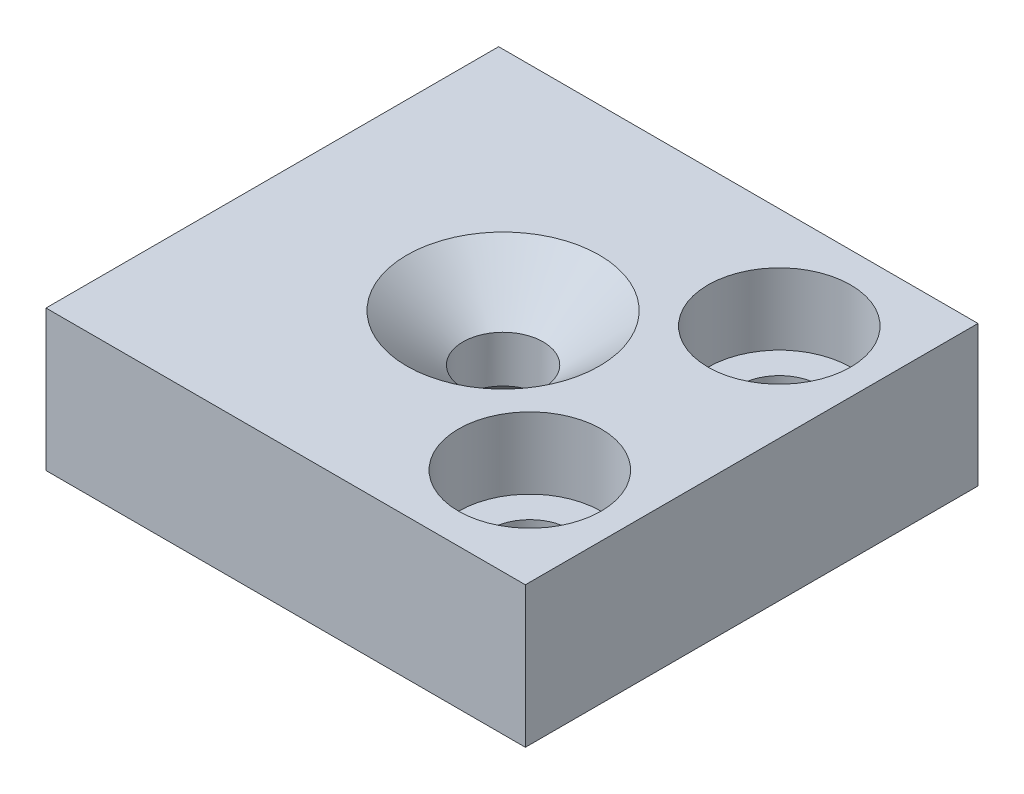
ISO-10303-21;
HEADER;
FILE_DESCRIPTION(('STEP AP214'),'2;1');
FILE_NAME('part.step','',(''),(''),'','','');
FILE_SCHEMA(('AUTOMOTIVE_DESIGN { 1 0 10303 214 1 1 1 1 }'));
ENDSEC;
DATA;
#1=APPLICATION_CONTEXT('core data for automotive mechanical design processes');
#2=APPLICATION_PROTOCOL_DEFINITION('international standard','automotive_design',2000,#1);
#3=PRODUCT_CONTEXT('',#1,'mechanical');
#4=PRODUCT('Part','Part','',(#3));
#5=PRODUCT_RELATED_PRODUCT_CATEGORY('part','',(#4));
#6=PRODUCT_DEFINITION_FORMATION('','',#4);
#7=PRODUCT_DEFINITION_CONTEXT('part definition',#1,'design');
#8=PRODUCT_DEFINITION('design','',#6,#7);
#9=PRODUCT_DEFINITION_SHAPE('','',#8);
#10=(LENGTH_UNIT() NAMED_UNIT(*) SI_UNIT(.MILLI.,.METRE.));
#11=(NAMED_UNIT(*) PLANE_ANGLE_UNIT() SI_UNIT($,.RADIAN.));
#12=(NAMED_UNIT(*) SI_UNIT($,.STERADIAN.) SOLID_ANGLE_UNIT());
#13=UNCERTAINTY_MEASURE_WITH_UNIT(LENGTH_MEASURE(1.E-05),#10,'distance_accuracy_value','');
#14=(GEOMETRIC_REPRESENTATION_CONTEXT(3) GLOBAL_UNCERTAINTY_ASSIGNED_CONTEXT((#13)) GLOBAL_UNIT_ASSIGNED_CONTEXT((#10,
#11,#12)) REPRESENTATION_CONTEXT('',''));
#15=CARTESIAN_POINT('',(0.,0.,0.));
#16=DIRECTION('',(0.,0.,1.));
#17=DIRECTION('',(1.,0.,0.));
#18=AXIS2_PLACEMENT_3D('',#15,#16,#17);
#19=CARTESIAN_POINT('',(9.50000000017326,3.95,-19.7));
#20=DIRECTION('',(-1.,0.,0.));
#21=DIRECTION('',(0.,0.,1.));
#22=AXIS2_PLACEMENT_3D('',#19,#20,#21);
#23=CONICAL_SURFACE('',#22,1.64999999975608,1.02974425845289);
#24=CARTESIAN_POINT('',(10.4914200215944,3.95,-19.7000000001137));
#25=VERTEX_POINT('',#24);
#26=VERTEX_LOOP('',#25);
#27=FACE_BOUND('',#26,.T.);
#28=CARTESIAN_POINT('',(9.5,3.95,-19.7));
#29=DIRECTION('',(-1.,0.,0.));
#30=DIRECTION('',(0.,0.,1.));
#31=AXIS2_PLACEMENT_3D('',#28,#29,#30);
#32=CIRCLE('',#31,1.65);
#33=CARTESIAN_POINT('',(9.5,3.95,-18.05));
#34=VERTEX_POINT('',#33);
#35=EDGE_CURVE('E67',#34,#34,#32,.T.);
#36=ORIENTED_EDGE('',*,*,#35,.T.);
#37=EDGE_LOOP('',(#36));
#38=FACE_BOUND('',#37,.T.);
#39=ADVANCED_FACE('F17',(#27,#38),#23,.F.);
#40=CARTESIAN_POINT('',(9.50000000000273,3.95,-5.7));
#41=DIRECTION('',(-1.,0.,0.));
#42=DIRECTION('',(0.,0.,1.));
#43=AXIS2_PLACEMENT_3D('',#40,#41,#42);
#44=CONICAL_SURFACE('',#43,1.64999999987976,1.02974425849377);
#45=CARTESIAN_POINT('',(10.4914200215092,3.95,-5.70000000005684));
#46=VERTEX_POINT('',#45);
#47=VERTEX_LOOP('',#46);
#48=FACE_BOUND('',#47,.T.);
#49=CARTESIAN_POINT('',(9.5,3.95,-5.7));
#50=DIRECTION('',(-1.,0.,0.));
#51=DIRECTION('',(0.,0.,1.));
#52=AXIS2_PLACEMENT_3D('',#49,#50,#51);
#53=CIRCLE('',#52,1.65);
#54=CARTESIAN_POINT('',(9.5,3.95,-4.05));
#55=VERTEX_POINT('',#54);
#56=EDGE_CURVE('E69',#55,#55,#53,.T.);
#57=ORIENTED_EDGE('',*,*,#56,.T.);
#58=EDGE_LOOP('',(#57));
#59=FACE_BOUND('',#58,.T.);
#60=ADVANCED_FACE('F64',(#48,#59),#44,.F.);
#61=CARTESIAN_POINT('',(21.45,7.9,-5.7));
#62=DIRECTION('',(0.,1.,0.));
#63=DIRECTION('',(0.,0.,1.));
#64=AXIS2_PLACEMENT_3D('',#61,#62,#63);
#65=CYLINDRICAL_SURFACE('',#64,4.);
#66=CARTESIAN_POINT('',(21.45,3.9,-5.7));
#67=DIRECTION('',(0.,1.,0.));
#68=DIRECTION('',(0.,0.,1.));
#69=AXIS2_PLACEMENT_3D('',#66,#67,#68);
#70=CIRCLE('',#69,4.);
#71=CARTESIAN_POINT('',(21.45,3.9,-1.7));
#72=VERTEX_POINT('',#71);
#73=EDGE_CURVE('E20',#72,#72,#70,.F.);
#74=ORIENTED_EDGE('',*,*,#73,.T.);
#75=EDGE_LOOP('',(#74));
#76=FACE_BOUND('',#75,.T.);
#77=CARTESIAN_POINT('',(21.45,7.9,-5.7));
#78=DIRECTION('',(0.,1.,0.));
#79=DIRECTION('',(0.,0.,1.));
#80=AXIS2_PLACEMENT_3D('',#77,#78,#79);
#81=CIRCLE('',#80,4.);
#82=CARTESIAN_POINT('',(21.45,7.9,-1.7));
#83=VERTEX_POINT('',#82);
#84=EDGE_CURVE('E73',#83,#83,#81,.T.);
#85=ORIENTED_EDGE('',*,*,#84,.T.);
#86=EDGE_LOOP('',(#85));
#87=FACE_BOUND('',#86,.T.);
#88=ADVANCED_FACE('F117',(#76,#87),#65,.F.);
#89=CARTESIAN_POINT('',(21.45,7.9,-19.7));
#90=DIRECTION('',(0.,1.,0.));
#91=DIRECTION('',(0.,0.,1.));
#92=AXIS2_PLACEMENT_3D('',#89,#90,#91);
#93=CYLINDRICAL_SURFACE('',#92,4.);
#94=CARTESIAN_POINT('',(21.45,3.9,-19.7));
#95=DIRECTION('',(0.,1.,0.));
#96=DIRECTION('',(0.,0.,1.));
#97=AXIS2_PLACEMENT_3D('',#94,#95,#96);
#98=CIRCLE('',#97,4.);
#99=CARTESIAN_POINT('',(21.45,3.9,-15.7));
#100=VERTEX_POINT('',#99);
#101=EDGE_CURVE('E76',#100,#100,#98,.F.);
#102=ORIENTED_EDGE('',*,*,#101,.T.);
#103=EDGE_LOOP('',(#102));
#104=FACE_BOUND('',#103,.T.);
#105=CARTESIAN_POINT('',(21.45,7.9,-19.7));
#106=DIRECTION('',(0.,1.,0.));
#107=DIRECTION('',(0.,0.,1.));
#108=AXIS2_PLACEMENT_3D('',#105,#106,#107);
#109=CIRCLE('',#108,4.);
#110=CARTESIAN_POINT('',(21.45,7.9,-15.7));
#111=VERTEX_POINT('',#110);
#112=EDGE_CURVE('E107',#111,#111,#109,.T.);
#113=ORIENTED_EDGE('',*,*,#112,.T.);
#114=EDGE_LOOP('',(#113));
#115=FACE_BOUND('',#114,.T.);
#116=ADVANCED_FACE('F198',(#104,#115),#93,.F.);
#117=CARTESIAN_POINT('',(12.95,7.90000000000646,-12.7));
#118=DIRECTION('',(0.,1.,0.));
#119=DIRECTION('',(0.,0.,1.));
#120=AXIS2_PLACEMENT_3D('',#117,#118,#119);
#121=CONICAL_SURFACE('',#120,5.40000000001346,0.8726646259941);
#122=CARTESIAN_POINT('',(12.95,5.25683616179157,-12.7));
#123=DIRECTION('',(0.,1.,0.));
#124=DIRECTION('',(0.,0.,1.));
#125=AXIS2_PLACEMENT_3D('',#122,#123,#124);
#126=CIRCLE('',#125,2.25);
#127=CARTESIAN_POINT('',(12.95,5.25683616179157,-10.45));
#128=VERTEX_POINT('',#127);
#129=EDGE_CURVE('E70',#128,#128,#126,.F.);
#130=ORIENTED_EDGE('',*,*,#129,.T.);
#131=EDGE_LOOP('',(#130));
#132=FACE_BOUND('',#131,.T.);
#133=CARTESIAN_POINT('',(12.95,7.90000000000249,-12.7));
#134=DIRECTION('',(0.,1.,0.));
#135=DIRECTION('',(0.,0.,1.));
#136=AXIS2_PLACEMENT_3D('',#133,#134,#135);
#137=CIRCLE('',#136,5.40000000000873);
#138=CARTESIAN_POINT('',(12.95,7.90000000000249,-7.29999999999127));
#139=VERTEX_POINT('',#138);
#140=EDGE_CURVE('E104',#139,#139,#137,.T.);
#141=ORIENTED_EDGE('',*,*,#140,.T.);
#142=EDGE_LOOP('',(#141));
#143=FACE_BOUND('',#142,.T.);
#144=ADVANCED_FACE('F124',(#132,#143),#121,.F.);
#145=CARTESIAN_POINT('',(23.7,3.9,-5.7));
#146=DIRECTION('',(0.,-1.,0.));
#147=DIRECTION('',(0.,0.,-1.));
#148=AXIS2_PLACEMENT_3D('',#145,#146,#147);
#149=PLANE('',#148);
#150=ORIENTED_EDGE('',*,*,#73,.F.);
#151=EDGE_LOOP('',(#150));
#152=FACE_BOUND('',#151,.T.);
#153=CARTESIAN_POINT('',(21.45,3.9,-5.7));
#154=DIRECTION('',(0.,1.,0.));
#155=DIRECTION('',(0.,0.,1.));
#156=AXIS2_PLACEMENT_3D('',#153,#154,#155);
#157=CIRCLE('',#156,2.25);
#158=CARTESIAN_POINT('',(21.45,3.9,-3.45));
#159=VERTEX_POINT('',#158);
#160=EDGE_CURVE('E101',#159,#159,#157,.F.);
#161=ORIENTED_EDGE('',*,*,#160,.T.);
#162=EDGE_LOOP('',(#161));
#163=FACE_BOUND('',#162,.T.);
#164=ADVANCED_FACE('F120',(#152,#163),#149,.F.);
#165=CARTESIAN_POINT('',(23.7,3.9,-19.7));
#166=DIRECTION('',(0.,-1.,0.));
#167=DIRECTION('',(0.,0.,-1.));
#168=AXIS2_PLACEMENT_3D('',#165,#166,#167);
#169=PLANE('',#168);
#170=ORIENTED_EDGE('',*,*,#101,.F.);
#171=EDGE_LOOP('',(#170));
#172=FACE_BOUND('',#171,.T.);
#173=CARTESIAN_POINT('',(21.45,3.9,-19.7));
#174=DIRECTION('',(0.,1.,0.));
#175=DIRECTION('',(0.,0.,1.));
#176=AXIS2_PLACEMENT_3D('',#173,#174,#175);
#177=CIRCLE('',#176,2.25);
#178=CARTESIAN_POINT('',(21.45,3.9,-17.45));
#179=VERTEX_POINT('',#178);
#180=EDGE_CURVE('E98',#179,#179,#177,.F.);
#181=ORIENTED_EDGE('',*,*,#180,.T.);
#182=EDGE_LOOP('',(#181));
#183=FACE_BOUND('',#182,.T.);
#184=ADVANCED_FACE('F123',(#172,#183),#169,.F.);
#185=CARTESIAN_POINT('',(12.95,7.9,-12.7));
#186=DIRECTION('',(0.,1.,0.));
#187=DIRECTION('',(0.,0.,1.));
#188=AXIS2_PLACEMENT_3D('',#185,#186,#187);
#189=CYLINDRICAL_SURFACE('',#188,2.25);
#190=CARTESIAN_POINT('',(12.95,2.64316383822916,-12.7));
#191=DIRECTION('',(0.,-1.,0.));
#192=DIRECTION('',(0.,0.,-1.));
#193=AXIS2_PLACEMENT_3D('',#190,#191,#192);
#194=CIRCLE('',#193,2.24999999999891);
#195=CARTESIAN_POINT('',(12.95,2.64316383822916,-14.9499999999989));
#196=VERTEX_POINT('',#195);
#197=EDGE_CURVE('E97',#196,#196,#194,.T.);
#198=ORIENTED_EDGE('',*,*,#197,.T.);
#199=EDGE_LOOP('',(#198));
#200=FACE_BOUND('',#199,.T.);
#201=ORIENTED_EDGE('',*,*,#129,.F.);
#202=EDGE_LOOP('',(#201));
#203=FACE_BOUND('',#202,.T.);
#204=ADVANCED_FACE('F185',(#200,#203),#189,.F.);
#205=CARTESIAN_POINT('',(0.,3.95,-19.7));
#206=DIRECTION('',(-1.,0.,0.));
#207=DIRECTION('',(0.,0.,1.));
#208=AXIS2_PLACEMENT_3D('',#205,#206,#207);
#209=CYLINDRICAL_SURFACE('',#208,1.65);
#210=ORIENTED_EDGE('',*,*,#35,.F.);
#211=EDGE_LOOP('',(#210));
#212=FACE_BOUND('',#211,.T.);
#213=CARTESIAN_POINT('',(0.,3.95,-19.7));
#214=DIRECTION('',(-1.,0.,0.));
#215=DIRECTION('',(0.,0.,1.));
#216=AXIS2_PLACEMENT_3D('',#213,#214,#215);
#217=CIRCLE('',#216,1.65);
#218=CARTESIAN_POINT('',(0.,3.95,-18.05));
#219=VERTEX_POINT('',#218);
#220=EDGE_CURVE('E94',#219,#219,#217,.T.);
#221=ORIENTED_EDGE('',*,*,#220,.T.);
#222=EDGE_LOOP('',(#221));
#223=FACE_BOUND('',#222,.T.);
#224=ADVANCED_FACE('F191',(#212,#223),#209,.F.);
#225=CARTESIAN_POINT('',(0.,3.95,-5.7));
#226=DIRECTION('',(-1.,0.,0.));
#227=DIRECTION('',(0.,0.,1.));
#228=AXIS2_PLACEMENT_3D('',#225,#226,#227);
#229=CYLINDRICAL_SURFACE('',#228,1.65);
#230=ORIENTED_EDGE('',*,*,#56,.F.);
#231=EDGE_LOOP('',(#230));
#232=FACE_BOUND('',#231,.T.);
#233=CARTESIAN_POINT('',(0.,3.95,-5.7));
#234=DIRECTION('',(-1.,0.,0.));
#235=DIRECTION('',(0.,0.,1.));
#236=AXIS2_PLACEMENT_3D('',#233,#234,#235);
#237=CIRCLE('',#236,1.65);
#238=CARTESIAN_POINT('',(0.,3.95,-4.05));
#239=VERTEX_POINT('',#238);
#240=EDGE_CURVE('E90',#239,#239,#237,.T.);
#241=ORIENTED_EDGE('',*,*,#240,.T.);
#242=EDGE_LOOP('',(#241));
#243=FACE_BOUND('',#242,.T.);
#244=ADVANCED_FACE('F142',(#232,#243),#229,.F.);
#245=CARTESIAN_POINT('',(0.,7.9,-25.4));
#246=DIRECTION('',(0.,-1.,0.));
#247=DIRECTION('',(0.,0.,-1.));
#248=AXIS2_PLACEMENT_3D('',#245,#246,#247);
#249=PLANE('',#248);
#250=DIRECTION('',(-1.,0.,0.));
#251=VECTOR('',#250,1.);
#252=CARTESIAN_POINT('',(0.,7.9,0.));
#253=LINE('',#252,#251);
#254=CARTESIAN_POINT('',(0.,7.9,0.));
#255=VERTEX_POINT('',#254);
#256=CARTESIAN_POINT('',(26.9,7.9,0.));
#257=VERTEX_POINT('',#256);
#258=EDGE_CURVE('E352',#255,#257,#253,.F.);
#259=ORIENTED_EDGE('',*,*,#258,.T.);
#260=DIRECTION('',(0.,0.,1.));
#261=VECTOR('',#260,1.);
#262=CARTESIAN_POINT('',(26.9,7.9,0.));
#263=LINE('',#262,#261);
#264=CARTESIAN_POINT('',(26.9,7.9,-25.4));
#265=VERTEX_POINT('',#264);
#266=EDGE_CURVE('E345',#257,#265,#263,.F.);
#267=ORIENTED_EDGE('',*,*,#266,.T.);
#268=DIRECTION('',(1.,0.,0.));
#269=VECTOR('',#268,1.);
#270=CARTESIAN_POINT('',(0.,7.9,-25.4));
#271=LINE('',#270,#269);
#272=CARTESIAN_POINT('',(0.,7.9,-25.4));
#273=VERTEX_POINT('',#272);
#274=EDGE_CURVE('E341',#265,#273,#271,.F.);
#275=ORIENTED_EDGE('',*,*,#274,.T.);
#276=DIRECTION('',(0.,0.,-1.));
#277=VECTOR('',#276,1.);
#278=CARTESIAN_POINT('',(0.,7.9,0.));
#279=LINE('',#278,#277);
#280=EDGE_CURVE('E93',#273,#255,#279,.F.);
#281=ORIENTED_EDGE('',*,*,#280,.T.);
#282=EDGE_LOOP('',(#259,#267,#275,#281));
#283=FACE_BOUND('',#282,.T.);
#284=ORIENTED_EDGE('',*,*,#140,.F.);
#285=EDGE_LOOP('',(#284));
#286=FACE_BOUND('',#285,.T.);
#287=ORIENTED_EDGE('',*,*,#112,.F.);
#288=EDGE_LOOP('',(#287));
#289=FACE_BOUND('',#288,.T.);
#290=ORIENTED_EDGE('',*,*,#84,.F.);
#291=EDGE_LOOP('',(#290));
#292=FACE_BOUND('',#291,.T.);
#293=ADVANCED_FACE('F131',(#283,#286,#289,#292),#249,.F.);
#294=CARTESIAN_POINT('',(21.45,7.9,-5.7));
#295=DIRECTION('',(0.,1.,0.));
#296=DIRECTION('',(0.,0.,1.));
#297=AXIS2_PLACEMENT_3D('',#294,#295,#296);
#298=CYLINDRICAL_SURFACE('',#297,2.25);
#299=CARTESIAN_POINT('',(21.45,0.,-5.7));
#300=DIRECTION('',(0.,1.,0.));
#301=DIRECTION('',(0.,0.,1.));
#302=AXIS2_PLACEMENT_3D('',#299,#300,#301);
#303=CIRCLE('',#302,2.25);
#304=CARTESIAN_POINT('',(21.45,0.,-3.45));
#305=VERTEX_POINT('',#304);
#306=EDGE_CURVE('E87',#305,#305,#303,.T.);
#307=ORIENTED_EDGE('',*,*,#306,.F.);
#308=EDGE_LOOP('',(#307));
#309=FACE_BOUND('',#308,.T.);
#310=ORIENTED_EDGE('',*,*,#160,.F.);
#311=EDGE_LOOP('',(#310));
#312=FACE_BOUND('',#311,.T.);
#313=ADVANCED_FACE('F128',(#309,#312),#298,.F.);
#314=CARTESIAN_POINT('',(21.45,7.9,-19.7));
#315=DIRECTION('',(0.,1.,0.));
#316=DIRECTION('',(0.,0.,1.));
#317=AXIS2_PLACEMENT_3D('',#314,#315,#316);
#318=CYLINDRICAL_SURFACE('',#317,2.25);
#319=CARTESIAN_POINT('',(21.45,0.,-19.7));
#320=DIRECTION('',(0.,1.,0.));
#321=DIRECTION('',(0.,0.,1.));
#322=AXIS2_PLACEMENT_3D('',#319,#320,#321);
#323=CIRCLE('',#322,2.25);
#324=CARTESIAN_POINT('',(21.45,0.,-17.45));
#325=VERTEX_POINT('',#324);
#326=EDGE_CURVE('E84',#325,#325,#323,.T.);
#327=ORIENTED_EDGE('',*,*,#326,.F.);
#328=EDGE_LOOP('',(#327));
#329=FACE_BOUND('',#328,.T.);
#330=ORIENTED_EDGE('',*,*,#180,.F.);
#331=EDGE_LOOP('',(#330));
#332=FACE_BOUND('',#331,.T.);
#333=ADVANCED_FACE('F130',(#329,#332),#318,.F.);
#334=CARTESIAN_POINT('',(12.95,0.,-12.7));
#335=DIRECTION('',(0.,-1.,0.));
#336=DIRECTION('',(0.,0.,-1.));
#337=AXIS2_PLACEMENT_3D('',#334,#335,#336);
#338=CONICAL_SURFACE('',#337,5.400000000004,0.872664625992396);
#339=ORIENTED_EDGE('',*,*,#197,.F.);
#340=EDGE_LOOP('',(#339));
#341=FACE_BOUND('',#340,.T.);
#342=CARTESIAN_POINT('',(12.95,-3.96798148958359E-12,-12.7));
#343=DIRECTION('',(0.,-1.,0.));
#344=DIRECTION('',(0.,0.,-1.));
#345=AXIS2_PLACEMENT_3D('',#342,#343,#344);
#346=CIRCLE('',#345,5.40000000000873);
#347=CARTESIAN_POINT('',(12.95,-3.96798148958359E-12,-18.1000000000087));
#348=VERTEX_POINT('',#347);
#349=EDGE_CURVE('E80',#348,#348,#346,.F.);
#350=ORIENTED_EDGE('',*,*,#349,.F.);
#351=EDGE_LOOP('',(#350));
#352=FACE_BOUND('',#351,.T.);
#353=ADVANCED_FACE('F139',(#341,#352),#338,.F.);
#354=CARTESIAN_POINT('',(0.,7.9,0.));
#355=DIRECTION('',(1.,0.,0.));
#356=DIRECTION('',(0.,0.,-1.));
#357=AXIS2_PLACEMENT_3D('',#354,#355,#356);
#358=PLANE('',#357);
#359=DIRECTION('',(0.,1.,0.));
#360=VECTOR('',#359,1.);
#361=CARTESIAN_POINT('',(0.,7.9,0.));
#362=LINE('',#361,#360);
#363=CARTESIAN_POINT('',(0.,0.,0.));
#364=VERTEX_POINT('',#363);
#365=EDGE_CURVE('E349',#364,#255,#362,.T.);
#366=ORIENTED_EDGE('',*,*,#365,.T.);
#367=ORIENTED_EDGE('',*,*,#280,.F.);
#368=DIRECTION('',(0.,1.,0.));
#369=VECTOR('',#368,1.);
#370=CARTESIAN_POINT('',(0.,7.9,-25.4));
#371=LINE('',#370,#369);
#372=CARTESIAN_POINT('',(0.,0.,-25.4));
#373=VERTEX_POINT('',#372);
#374=EDGE_CURVE('E343',#273,#373,#371,.F.);
#375=ORIENTED_EDGE('',*,*,#374,.T.);
#376=DIRECTION('',(0.,0.,-1.));
#377=VECTOR('',#376,1.);
#378=CARTESIAN_POINT('',(0.,0.,-25.4));
#379=LINE('',#378,#377);
#380=EDGE_CURVE('E83',#364,#373,#379,.T.);
#381=ORIENTED_EDGE('',*,*,#380,.F.);
#382=EDGE_LOOP('',(#366,#367,#375,#381));
#383=FACE_BOUND('',#382,.T.);
#384=ORIENTED_EDGE('',*,*,#240,.F.);
#385=EDGE_LOOP('',(#384));
#386=FACE_BOUND('',#385,.T.);
#387=ORIENTED_EDGE('',*,*,#220,.F.);
#388=EDGE_LOOP('',(#387));
#389=FACE_BOUND('',#388,.T.);
#390=ADVANCED_FACE('F165',(#383,#386,#389),#358,.F.);
#391=CARTESIAN_POINT('',(0.,7.9,-25.4));
#392=DIRECTION('',(0.,0.,1.));
#393=DIRECTION('',(1.,0.,0.));
#394=AXIS2_PLACEMENT_3D('',#391,#392,#393);
#395=PLANE('',#394);
#396=ORIENTED_EDGE('',*,*,#374,.F.);
#397=ORIENTED_EDGE('',*,*,#274,.F.);
#398=DIRECTION('',(0.,1.,0.));
#399=VECTOR('',#398,1.);
#400=CARTESIAN_POINT('',(26.9,7.9,-25.4));
#401=LINE('',#400,#399);
#402=CARTESIAN_POINT('',(26.9,0.,-25.4));
#403=VERTEX_POINT('',#402);
#404=EDGE_CURVE('E347',#265,#403,#401,.F.);
#405=ORIENTED_EDGE('',*,*,#404,.T.);
#406=DIRECTION('',(1.,0.,0.));
#407=VECTOR('',#406,1.);
#408=CARTESIAN_POINT('',(0.,0.,-25.4));
#409=LINE('',#408,#407);
#410=EDGE_CURVE('E357',#373,#403,#409,.T.);
#411=ORIENTED_EDGE('',*,*,#410,.F.);
#412=EDGE_LOOP('',(#396,#397,#405,#411));
#413=FACE_BOUND('',#412,.T.);
#414=ADVANCED_FACE('F162',(#413),#395,.F.);
#415=CARTESIAN_POINT('',(26.9,7.9,0.));
#416=DIRECTION('',(-1.,0.,0.));
#417=DIRECTION('',(0.,0.,1.));
#418=AXIS2_PLACEMENT_3D('',#415,#416,#417);
#419=PLANE('',#418);
#420=ORIENTED_EDGE('',*,*,#404,.F.);
#421=ORIENTED_EDGE('',*,*,#266,.F.);
#422=DIRECTION('',(0.,1.,0.));
#423=VECTOR('',#422,1.);
#424=CARTESIAN_POINT('',(26.9,7.9,0.));
#425=LINE('',#424,#423);
#426=CARTESIAN_POINT('',(26.9,0.,0.));
#427=VERTEX_POINT('',#426);
#428=EDGE_CURVE('E35',#257,#427,#425,.F.);
#429=ORIENTED_EDGE('',*,*,#428,.T.);
#430=DIRECTION('',(0.,0.,-1.));
#431=VECTOR('',#430,1.);
#432=CARTESIAN_POINT('',(26.9,0.,-25.4));
#433=LINE('',#432,#431);
#434=EDGE_CURVE('E26',#403,#427,#433,.F.);
#435=ORIENTED_EDGE('',*,*,#434,.F.);
#436=EDGE_LOOP('',(#420,#421,#429,#435));
#437=FACE_BOUND('',#436,.T.);
#438=ADVANCED_FACE('F154',(#437),#419,.F.);
#439=CARTESIAN_POINT('',(0.,7.9,0.));
#440=DIRECTION('',(0.,0.,-1.));
#441=DIRECTION('',(-1.,0.,0.));
#442=AXIS2_PLACEMENT_3D('',#439,#440,#441);
#443=PLANE('',#442);
#444=ORIENTED_EDGE('',*,*,#428,.F.);
#445=ORIENTED_EDGE('',*,*,#258,.F.);
#446=ORIENTED_EDGE('',*,*,#365,.F.);
#447=DIRECTION('',(1.,0.,0.));
#448=VECTOR('',#447,1.);
#449=CARTESIAN_POINT('',(0.,0.,0.));
#450=LINE('',#449,#448);
#451=EDGE_CURVE('E11',#427,#364,#450,.F.);
#452=ORIENTED_EDGE('',*,*,#451,.F.);
#453=EDGE_LOOP('',(#444,#445,#446,#452));
#454=FACE_BOUND('',#453,.T.);
#455=ADVANCED_FACE('F148',(#454),#443,.F.);
#456=CARTESIAN_POINT('',(0.,0.,-25.4));
#457=DIRECTION('',(0.,-1.,0.));
#458=DIRECTION('',(0.,0.,-1.));
#459=AXIS2_PLACEMENT_3D('',#456,#457,#458);
#460=PLANE('',#459);
#461=ORIENTED_EDGE('',*,*,#434,.T.);
#462=ORIENTED_EDGE('',*,*,#451,.T.);
#463=ORIENTED_EDGE('',*,*,#380,.T.);
#464=ORIENTED_EDGE('',*,*,#410,.T.);
#465=EDGE_LOOP('',(#461,#462,#463,#464));
#466=FACE_BOUND('',#465,.T.);
#467=ORIENTED_EDGE('',*,*,#349,.T.);
#468=EDGE_LOOP('',(#467));
#469=FACE_BOUND('',#468,.T.);
#470=ORIENTED_EDGE('',*,*,#326,.T.);
#471=EDGE_LOOP('',(#470));
#472=FACE_BOUND('',#471,.T.);
#473=ORIENTED_EDGE('',*,*,#306,.T.);
#474=EDGE_LOOP('',(#473));
#475=FACE_BOUND('',#474,.T.);
#476=ADVANCED_FACE('F146',(#466,#469,#472,#475),#460,.T.);
#477=CLOSED_SHELL('',(#39,#60,#88,#116,#144,#164,#184,#204,#224,#244,#293,#313,#333,#353,#390,
#414,#438,#455,#476));
#478=MANIFOLD_SOLID_BREP('B1',#477);
#479=ADVANCED_BREP_SHAPE_REPRESENTATION('',(#18,#478),#14);
#480=SHAPE_DEFINITION_REPRESENTATION(#9,#479);
ENDSEC;
END-ISO-10303-21;
